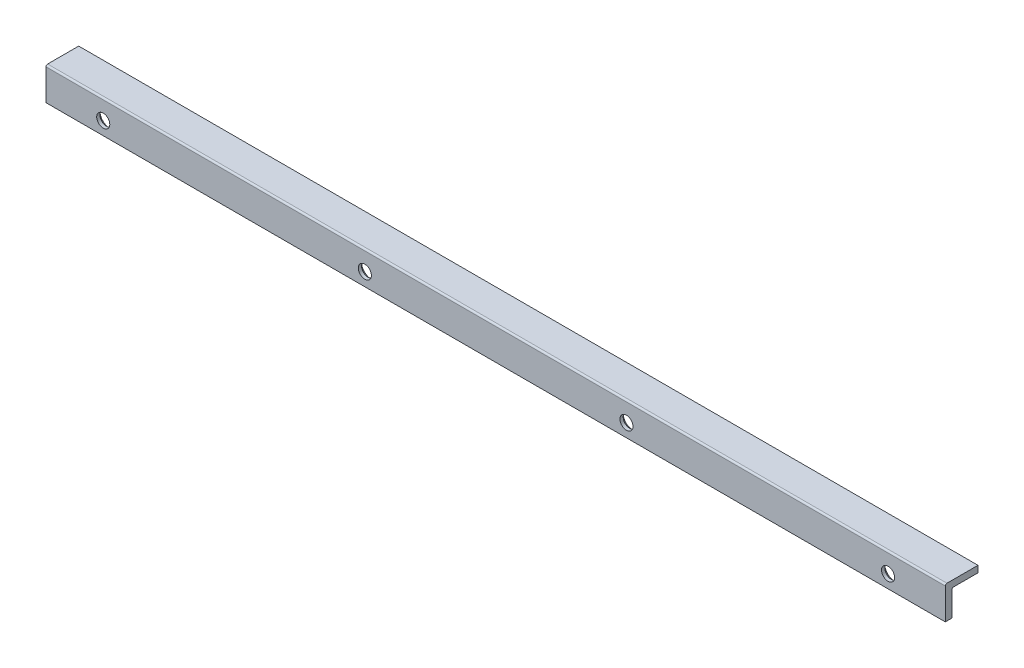
ISO-10303-21;
HEADER;
FILE_DESCRIPTION(('STEP AP214'),'2;1');
FILE_NAME('part.step','',(''),(''),'','','');
FILE_SCHEMA(('AUTOMOTIVE_DESIGN { 1 0 10303 214 1 1 1 1 }'));
ENDSEC;
DATA;
#1=APPLICATION_CONTEXT('core data for automotive mechanical design processes');
#2=APPLICATION_PROTOCOL_DEFINITION('international standard','automotive_design',2000,#1);
#3=PRODUCT_CONTEXT('',#1,'mechanical');
#4=PRODUCT('Part','Part','',(#3));
#5=PRODUCT_RELATED_PRODUCT_CATEGORY('part','',(#4));
#6=PRODUCT_DEFINITION_FORMATION('','',#4);
#7=PRODUCT_DEFINITION_CONTEXT('part definition',#1,'design');
#8=PRODUCT_DEFINITION('design','',#6,#7);
#9=PRODUCT_DEFINITION_SHAPE('','',#8);
#10=(LENGTH_UNIT() NAMED_UNIT(*) SI_UNIT(.MILLI.,.METRE.));
#11=(NAMED_UNIT(*) PLANE_ANGLE_UNIT() SI_UNIT($,.RADIAN.));
#12=(NAMED_UNIT(*) SI_UNIT($,.STERADIAN.) SOLID_ANGLE_UNIT());
#13=UNCERTAINTY_MEASURE_WITH_UNIT(LENGTH_MEASURE(1.E-05),#10,'distance_accuracy_value','');
#14=(GEOMETRIC_REPRESENTATION_CONTEXT(3) GLOBAL_UNCERTAINTY_ASSIGNED_CONTEXT((#13)) GLOBAL_UNIT_ASSIGNED_CONTEXT((#10,
#11,#12)) REPRESENTATION_CONTEXT('',''));
#15=CARTESIAN_POINT('',(0.,0.,0.));
#16=DIRECTION('',(0.,0.,1.));
#17=DIRECTION('',(1.,0.,0.));
#18=AXIS2_PLACEMENT_3D('',#15,#16,#17);
#19=CARTESIAN_POINT('',(-137.5,-10.,0.));
#20=DIRECTION('',(0.,-1.,0.));
#21=DIRECTION('',(0.,0.,-1.));
#22=AXIS2_PLACEMENT_3D('',#19,#20,#21);
#23=PLANE('',#22);
#24=DIRECTION('',(1.,0.,0.));
#25=VECTOR('',#24,1.);
#26=CARTESIAN_POINT('',(-137.5,-10.,-2.));
#27=LINE('',#26,#25);
#28=CARTESIAN_POINT('',(-137.5,-10.,-2.));
#29=VERTEX_POINT('',#28);
#30=CARTESIAN_POINT('',(137.5,-10.,-2.));
#31=VERTEX_POINT('',#30);
#32=EDGE_CURVE('E114',#29,#31,#27,.T.);
#33=ORIENTED_EDGE('',*,*,#32,.T.);
#34=DIRECTION('',(0.,0.,-1.));
#35=VECTOR('',#34,1.);
#36=CARTESIAN_POINT('',(137.5,-10.,0.));
#37=LINE('',#36,#35);
#38=CARTESIAN_POINT('',(137.5,-10.,0.));
#39=VERTEX_POINT('',#38);
#40=EDGE_CURVE('E117',#39,#31,#37,.T.);
#41=ORIENTED_EDGE('',*,*,#40,.F.);
#42=DIRECTION('',(1.,0.,0.));
#43=VECTOR('',#42,1.);
#44=CARTESIAN_POINT('',(-137.5,-10.,0.));
#45=LINE('',#44,#43);
#46=CARTESIAN_POINT('',(-137.5,-10.,0.));
#47=VERTEX_POINT('',#46);
#48=EDGE_CURVE('E65',#47,#39,#45,.T.);
#49=ORIENTED_EDGE('',*,*,#48,.F.);
#50=DIRECTION('',(0.,0.,-1.));
#51=VECTOR('',#50,1.);
#52=CARTESIAN_POINT('',(-137.5,-10.,0.));
#53=LINE('',#52,#51);
#54=EDGE_CURVE('E118',#47,#29,#53,.T.);
#55=ORIENTED_EDGE('',*,*,#54,.T.);
#56=EDGE_LOOP('',(#33,#41,#49,#55));
#57=FACE_BOUND('',#56,.T.);
#58=ADVANCED_FACE('F48',(#57),#23,.T.);
#59=CARTESIAN_POINT('',(-137.5,-10.,0.));
#60=DIRECTION('',(0.,0.,1.));
#61=DIRECTION('',(1.,0.,0.));
#62=AXIS2_PLACEMENT_3D('',#59,#60,#61);
#63=PLANE('',#62);
#64=CARTESIAN_POINT('',(-120.,-6.00000000000001,0.));
#65=DIRECTION('',(0.,0.,1.));
#66=DIRECTION('',(1.,0.,0.));
#67=AXIS2_PLACEMENT_3D('',#64,#65,#66);
#68=CIRCLE('',#67,2.);
#69=CARTESIAN_POINT('',(-118.,-6.00000000000001,0.));
#70=VERTEX_POINT('',#69);
#71=EDGE_CURVE('E140',#70,#70,#68,.T.);
#72=ORIENTED_EDGE('',*,*,#71,.F.);
#73=EDGE_LOOP('',(#72));
#74=FACE_BOUND('',#73,.T.);
#75=CARTESIAN_POINT('',(-40.,-6.,0.));
#76=DIRECTION('',(0.,0.,1.));
#77=DIRECTION('',(1.,0.,0.));
#78=AXIS2_PLACEMENT_3D('',#75,#76,#77);
#79=CIRCLE('',#78,2.);
#80=CARTESIAN_POINT('',(-38.,-6.,0.));
#81=VERTEX_POINT('',#80);
#82=EDGE_CURVE('E144',#81,#81,#79,.T.);
#83=ORIENTED_EDGE('',*,*,#82,.F.);
#84=EDGE_LOOP('',(#83));
#85=FACE_BOUND('',#84,.T.);
#86=CARTESIAN_POINT('',(40.,-5.99999999999999,0.));
#87=DIRECTION('',(0.,0.,1.));
#88=DIRECTION('',(1.,0.,0.));
#89=AXIS2_PLACEMENT_3D('',#86,#87,#88);
#90=CIRCLE('',#89,2.);
#91=CARTESIAN_POINT('',(42.,-5.99999999999999,0.));
#92=VERTEX_POINT('',#91);
#93=EDGE_CURVE('E301',#92,#92,#90,.T.);
#94=ORIENTED_EDGE('',*,*,#93,.F.);
#95=EDGE_LOOP('',(#94));
#96=FACE_BOUND('',#95,.T.);
#97=CARTESIAN_POINT('',(120.,-5.99999999999997,0.));
#98=DIRECTION('',(0.,0.,1.));
#99=DIRECTION('',(1.,0.,0.));
#100=AXIS2_PLACEMENT_3D('',#97,#98,#99);
#101=CIRCLE('',#100,2.);
#102=CARTESIAN_POINT('',(122.,-5.99999999999997,0.));
#103=VERTEX_POINT('',#102);
#104=EDGE_CURVE('E147',#103,#103,#101,.T.);
#105=ORIENTED_EDGE('',*,*,#104,.F.);
#106=EDGE_LOOP('',(#105));
#107=FACE_BOUND('',#106,.T.);
#108=ORIENTED_EDGE('',*,*,#48,.T.);
#109=DIRECTION('',(0.,-1.,0.));
#110=VECTOR('',#109,1.);
#111=CARTESIAN_POINT('',(137.5,-10.,0.));
#112=LINE('',#111,#110);
#113=CARTESIAN_POINT('',(137.5,-0.500000000000004,0.));
#114=VERTEX_POINT('',#113);
#115=EDGE_CURVE('E138',#114,#39,#112,.T.);
#116=ORIENTED_EDGE('',*,*,#115,.F.);
#117=DIRECTION('',(1.,0.,0.));
#118=VECTOR('',#117,1.);
#119=CARTESIAN_POINT('',(-137.5,-0.500000000000004,0.));
#120=LINE('',#119,#118);
#121=CARTESIAN_POINT('',(-137.5,-0.500000000000004,0.));
#122=VERTEX_POINT('',#121);
#123=EDGE_CURVE('E73',#122,#114,#120,.T.);
#124=ORIENTED_EDGE('',*,*,#123,.F.);
#125=DIRECTION('',(0.,-1.,0.));
#126=VECTOR('',#125,1.);
#127=CARTESIAN_POINT('',(-137.5,-10.,0.));
#128=LINE('',#127,#126);
#129=EDGE_CURVE('E124',#122,#47,#128,.T.);
#130=ORIENTED_EDGE('',*,*,#129,.T.);
#131=EDGE_LOOP('',(#108,#116,#124,#130));
#132=FACE_BOUND('',#131,.T.);
#133=ADVANCED_FACE('F258',(#74,#85,#96,#107,#132),#63,.T.);
#134=CARTESIAN_POINT('',(-137.5,-0.5,-0.5));
#135=DIRECTION('',(1.,0.,0.));
#136=DIRECTION('',(0.,0.,-1.));
#137=AXIS2_PLACEMENT_3D('',#134,#135,#136);
#138=CYLINDRICAL_SURFACE('',#137,0.5);
#139=ORIENTED_EDGE('',*,*,#123,.T.);
#140=CARTESIAN_POINT('',(137.5,-0.5,-0.5));
#141=DIRECTION('',(1.,0.,0.));
#142=DIRECTION('',(0.,0.,1.));
#143=AXIS2_PLACEMENT_3D('',#140,#141,#142);
#144=CIRCLE('',#143,0.5);
#145=CARTESIAN_POINT('',(137.5,0.,-0.500000000000003));
#146=VERTEX_POINT('',#145);
#147=EDGE_CURVE('E164',#146,#114,#144,.T.);
#148=ORIENTED_EDGE('',*,*,#147,.F.);
#149=DIRECTION('',(1.,0.,0.));
#150=VECTOR('',#149,1.);
#151=CARTESIAN_POINT('',(-137.5,0.,-0.500000000000003));
#152=LINE('',#151,#150);
#153=CARTESIAN_POINT('',(-137.5,0.,-0.500000000000003));
#154=VERTEX_POINT('',#153);
#155=EDGE_CURVE('E200',#154,#146,#152,.T.);
#156=ORIENTED_EDGE('',*,*,#155,.F.);
#157=CARTESIAN_POINT('',(-137.5,-0.5,-0.5));
#158=DIRECTION('',(1.,0.,0.));
#159=DIRECTION('',(0.,0.,1.));
#160=AXIS2_PLACEMENT_3D('',#157,#158,#159);
#161=CIRCLE('',#160,0.5);
#162=EDGE_CURVE('E190',#154,#122,#161,.T.);
#163=ORIENTED_EDGE('',*,*,#162,.T.);
#164=EDGE_LOOP('',(#139,#148,#156,#163));
#165=FACE_BOUND('',#164,.T.);
#166=ADVANCED_FACE('F264',(#165),#138,.T.);
#167=CARTESIAN_POINT('',(-137.5,0.,-0.500000000000004));
#168=DIRECTION('',(0.,1.,0.));
#169=DIRECTION('',(0.,0.,1.));
#170=AXIS2_PLACEMENT_3D('',#167,#168,#169);
#171=PLANE('',#170);
#172=ORIENTED_EDGE('',*,*,#155,.T.);
#173=DIRECTION('',(0.,0.,1.));
#174=VECTOR('',#173,1.);
#175=CARTESIAN_POINT('',(137.5,0.,-0.500000000000004));
#176=LINE('',#175,#174);
#177=CARTESIAN_POINT('',(137.5,0.,-10.));
#178=VERTEX_POINT('',#177);
#179=EDGE_CURVE('E160',#178,#146,#176,.T.);
#180=ORIENTED_EDGE('',*,*,#179,.F.);
#181=DIRECTION('',(1.,0.,0.));
#182=VECTOR('',#181,1.);
#183=CARTESIAN_POINT('',(-137.5,0.,-10.));
#184=LINE('',#183,#182);
#185=CARTESIAN_POINT('',(-137.5,0.,-10.));
#186=VERTEX_POINT('',#185);
#187=EDGE_CURVE('E203',#186,#178,#184,.T.);
#188=ORIENTED_EDGE('',*,*,#187,.F.);
#189=DIRECTION('',(0.,0.,1.));
#190=VECTOR('',#189,1.);
#191=CARTESIAN_POINT('',(-137.5,0.,-0.500000000000004));
#192=LINE('',#191,#190);
#193=EDGE_CURVE('E186',#186,#154,#192,.T.);
#194=ORIENTED_EDGE('',*,*,#193,.T.);
#195=EDGE_LOOP('',(#172,#180,#188,#194));
#196=FACE_BOUND('',#195,.T.);
#197=ADVANCED_FACE('F321',(#196),#171,.T.);
#198=CARTESIAN_POINT('',(-137.5,0.,-10.));
#199=DIRECTION('',(0.,0.,-1.));
#200=DIRECTION('',(-1.,0.,0.));
#201=AXIS2_PLACEMENT_3D('',#198,#199,#200);
#202=PLANE('',#201);
#203=ORIENTED_EDGE('',*,*,#187,.T.);
#204=DIRECTION('',(0.,1.,0.));
#205=VECTOR('',#204,1.);
#206=CARTESIAN_POINT('',(137.5,0.,-10.));
#207=LINE('',#206,#205);
#208=CARTESIAN_POINT('',(137.5,-2.,-10.));
#209=VERTEX_POINT('',#208);
#210=EDGE_CURVE('E156',#209,#178,#207,.T.);
#211=ORIENTED_EDGE('',*,*,#210,.F.);
#212=DIRECTION('',(1.,0.,0.));
#213=VECTOR('',#212,1.);
#214=CARTESIAN_POINT('',(-137.5,-2.,-10.));
#215=LINE('',#214,#213);
#216=CARTESIAN_POINT('',(-137.5,-2.,-10.));
#217=VERTEX_POINT('',#216);
#218=EDGE_CURVE('E206',#217,#209,#215,.T.);
#219=ORIENTED_EDGE('',*,*,#218,.F.);
#220=DIRECTION('',(0.,1.,0.));
#221=VECTOR('',#220,1.);
#222=CARTESIAN_POINT('',(-137.5,0.,-10.));
#223=LINE('',#222,#221);
#224=EDGE_CURVE('E182',#217,#186,#223,.T.);
#225=ORIENTED_EDGE('',*,*,#224,.T.);
#226=EDGE_LOOP('',(#203,#211,#219,#225));
#227=FACE_BOUND('',#226,.T.);
#228=ADVANCED_FACE('F319',(#227),#202,.T.);
#229=CARTESIAN_POINT('',(-137.5,-2.,-10.));
#230=DIRECTION('',(0.,-1.,0.));
#231=DIRECTION('',(0.,0.,-1.));
#232=AXIS2_PLACEMENT_3D('',#229,#230,#231);
#233=PLANE('',#232);
#234=ORIENTED_EDGE('',*,*,#218,.T.);
#235=DIRECTION('',(0.,0.,-1.));
#236=VECTOR('',#235,1.);
#237=CARTESIAN_POINT('',(137.5,-2.,-10.));
#238=LINE('',#237,#236);
#239=CARTESIAN_POINT('',(137.5,-2.,-2.5));
#240=VERTEX_POINT('',#239);
#241=EDGE_CURVE('E152',#240,#209,#238,.T.);
#242=ORIENTED_EDGE('',*,*,#241,.F.);
#243=DIRECTION('',(1.,0.,0.));
#244=VECTOR('',#243,1.);
#245=CARTESIAN_POINT('',(-137.5,-2.,-2.5));
#246=LINE('',#245,#244);
#247=CARTESIAN_POINT('',(-137.5,-2.,-2.5));
#248=VERTEX_POINT('',#247);
#249=EDGE_CURVE('E209',#248,#240,#246,.T.);
#250=ORIENTED_EDGE('',*,*,#249,.F.);
#251=DIRECTION('',(0.,0.,-1.));
#252=VECTOR('',#251,1.);
#253=CARTESIAN_POINT('',(-137.5,-2.,-10.));
#254=LINE('',#253,#252);
#255=EDGE_CURVE('E178',#248,#217,#254,.T.);
#256=ORIENTED_EDGE('',*,*,#255,.T.);
#257=EDGE_LOOP('',(#234,#242,#250,#256));
#258=FACE_BOUND('',#257,.T.);
#259=ADVANCED_FACE('F317',(#258),#233,.T.);
#260=CARTESIAN_POINT('',(-137.5,-2.5,-2.5));
#261=DIRECTION('',(1.,0.,0.));
#262=DIRECTION('',(0.,0.,-1.));
#263=AXIS2_PLACEMENT_3D('',#260,#261,#262);
#264=CYLINDRICAL_SURFACE('',#263,0.5);
#265=ORIENTED_EDGE('',*,*,#249,.T.);
#266=CARTESIAN_POINT('',(137.5,-2.5,-2.5));
#267=DIRECTION('',(-1.,0.,0.));
#268=DIRECTION('',(0.,0.,-1.));
#269=AXIS2_PLACEMENT_3D('',#266,#267,#268);
#270=CIRCLE('',#269,0.5);
#271=CARTESIAN_POINT('',(137.5,-2.5,-2.));
#272=VERTEX_POINT('',#271);
#273=EDGE_CURVE('E133',#272,#240,#270,.T.);
#274=ORIENTED_EDGE('',*,*,#273,.F.);
#275=DIRECTION('',(1.,0.,0.));
#276=VECTOR('',#275,1.);
#277=CARTESIAN_POINT('',(-137.5,-2.5,-2.));
#278=LINE('',#277,#276);
#279=CARTESIAN_POINT('',(-137.5,-2.5,-2.));
#280=VERTEX_POINT('',#279);
#281=EDGE_CURVE('E123',#280,#272,#278,.T.);
#282=ORIENTED_EDGE('',*,*,#281,.F.);
#283=CARTESIAN_POINT('',(-137.5,-2.5,-2.5));
#284=DIRECTION('',(-1.,0.,0.));
#285=DIRECTION('',(0.,0.,-1.));
#286=AXIS2_PLACEMENT_3D('',#283,#284,#285);
#287=CIRCLE('',#286,0.5);
#288=EDGE_CURVE('E174',#280,#248,#287,.T.);
#289=ORIENTED_EDGE('',*,*,#288,.T.);
#290=EDGE_LOOP('',(#265,#274,#282,#289));
#291=FACE_BOUND('',#290,.T.);
#292=ADVANCED_FACE('F313',(#291),#264,.F.);
#293=CARTESIAN_POINT('',(-137.5,-10.,-2.));
#294=DIRECTION('',(0.,0.,-1.));
#295=DIRECTION('',(-1.,0.,0.));
#296=AXIS2_PLACEMENT_3D('',#293,#294,#295);
#297=PLANE('',#296);
#298=CARTESIAN_POINT('',(-120.,-6.00000000000001,-2.));
#299=DIRECTION('',(0.,0.,-1.));
#300=DIRECTION('',(-1.,0.,0.));
#301=AXIS2_PLACEMENT_3D('',#298,#299,#300);
#302=CIRCLE('',#301,3.);
#303=CARTESIAN_POINT('',(-123.,-6.00000000000001,-2.));
#304=VERTEX_POINT('',#303);
#305=EDGE_CURVE('E229',#304,#304,#302,.F.);
#306=ORIENTED_EDGE('',*,*,#305,.T.);
#307=EDGE_LOOP('',(#306));
#308=FACE_BOUND('',#307,.T.);
#309=CARTESIAN_POINT('',(-40.,-6.,-2.));
#310=DIRECTION('',(0.,0.,-1.));
#311=DIRECTION('',(-1.,0.,0.));
#312=AXIS2_PLACEMENT_3D('',#309,#310,#311);
#313=CIRCLE('',#312,3.);
#314=CARTESIAN_POINT('',(-43.,-6.,-2.));
#315=VERTEX_POINT('',#314);
#316=EDGE_CURVE('E225',#315,#315,#313,.F.);
#317=ORIENTED_EDGE('',*,*,#316,.T.);
#318=EDGE_LOOP('',(#317));
#319=FACE_BOUND('',#318,.T.);
#320=CARTESIAN_POINT('',(40.,-5.99999999999999,-2.));
#321=DIRECTION('',(0.,0.,-1.));
#322=DIRECTION('',(-1.,0.,0.));
#323=AXIS2_PLACEMENT_3D('',#320,#321,#322);
#324=CIRCLE('',#323,3.);
#325=CARTESIAN_POINT('',(37.,-5.99999999999999,-2.));
#326=VERTEX_POINT('',#325);
#327=EDGE_CURVE('E221',#326,#326,#324,.F.);
#328=ORIENTED_EDGE('',*,*,#327,.T.);
#329=EDGE_LOOP('',(#328));
#330=FACE_BOUND('',#329,.T.);
#331=CARTESIAN_POINT('',(120.,-5.99999999999997,-2.));
#332=DIRECTION('',(0.,0.,-1.));
#333=DIRECTION('',(-1.,0.,0.));
#334=AXIS2_PLACEMENT_3D('',#331,#332,#333);
#335=CIRCLE('',#334,3.);
#336=CARTESIAN_POINT('',(117.,-5.99999999999997,-2.));
#337=VERTEX_POINT('',#336);
#338=EDGE_CURVE('E217',#337,#337,#335,.F.);
#339=ORIENTED_EDGE('',*,*,#338,.T.);
#340=EDGE_LOOP('',(#339));
#341=FACE_BOUND('',#340,.T.);
#342=ORIENTED_EDGE('',*,*,#281,.T.);
#343=DIRECTION('',(0.,1.,0.));
#344=VECTOR('',#343,1.);
#345=CARTESIAN_POINT('',(137.5,-10.,-2.));
#346=LINE('',#345,#344);
#347=EDGE_CURVE('E127',#31,#272,#346,.T.);
#348=ORIENTED_EDGE('',*,*,#347,.F.);
#349=ORIENTED_EDGE('',*,*,#32,.F.);
#350=DIRECTION('',(0.,1.,0.));
#351=VECTOR('',#350,1.);
#352=CARTESIAN_POINT('',(-137.5,-10.,-2.));
#353=LINE('',#352,#351);
#354=EDGE_CURVE('E171',#29,#280,#353,.T.);
#355=ORIENTED_EDGE('',*,*,#354,.T.);
#356=EDGE_LOOP('',(#342,#348,#349,#355));
#357=FACE_BOUND('',#356,.T.);
#358=ADVANCED_FACE('F128',(#308,#319,#330,#341,#357),#297,.T.);
#359=CARTESIAN_POINT('',(-137.5,-2.5,-2.5));
#360=DIRECTION('',(1.,0.,0.));
#361=DIRECTION('',(0.,0.,-1.));
#362=AXIS2_PLACEMENT_3D('',#359,#360,#361);
#363=PLANE('',#362);
#364=ORIENTED_EDGE('',*,*,#54,.F.);
#365=ORIENTED_EDGE('',*,*,#129,.F.);
#366=ORIENTED_EDGE('',*,*,#162,.F.);
#367=ORIENTED_EDGE('',*,*,#193,.F.);
#368=ORIENTED_EDGE('',*,*,#224,.F.);
#369=ORIENTED_EDGE('',*,*,#255,.F.);
#370=ORIENTED_EDGE('',*,*,#288,.F.);
#371=ORIENTED_EDGE('',*,*,#354,.F.);
#372=EDGE_LOOP('',(#364,#365,#366,#367,#368,#369,#370,#371));
#373=FACE_BOUND('',#372,.T.);
#374=ADVANCED_FACE('F307',(#373),#363,.F.);
#375=CARTESIAN_POINT('',(137.5,-2.5,-2.5));
#376=DIRECTION('',(1.,0.,0.));
#377=DIRECTION('',(0.,0.,-1.));
#378=AXIS2_PLACEMENT_3D('',#375,#376,#377);
#379=PLANE('',#378);
#380=ORIENTED_EDGE('',*,*,#40,.T.);
#381=ORIENTED_EDGE('',*,*,#347,.T.);
#382=ORIENTED_EDGE('',*,*,#273,.T.);
#383=ORIENTED_EDGE('',*,*,#241,.T.);
#384=ORIENTED_EDGE('',*,*,#210,.T.);
#385=ORIENTED_EDGE('',*,*,#179,.T.);
#386=ORIENTED_EDGE('',*,*,#147,.T.);
#387=ORIENTED_EDGE('',*,*,#115,.T.);
#388=EDGE_LOOP('',(#380,#381,#382,#383,#384,#385,#386,#387));
#389=FACE_BOUND('',#388,.T.);
#390=ADVANCED_FACE('F136',(#389),#379,.T.);
#391=CARTESIAN_POINT('',(120.,-5.99999999999997,-10.));
#392=DIRECTION('',(0.,0.,1.));
#393=DIRECTION('',(1.,0.,0.));
#394=AXIS2_PLACEMENT_3D('',#391,#392,#393);
#395=CYLINDRICAL_SURFACE('',#394,2.);
#396=CARTESIAN_POINT('',(120.,-5.99999999999997,-1.00000000000001));
#397=DIRECTION('',(0.,0.,-1.));
#398=DIRECTION('',(-1.,0.,0.));
#399=AXIS2_PLACEMENT_3D('',#396,#397,#398);
#400=CIRCLE('',#399,2.);
#401=CARTESIAN_POINT('',(118.,-5.99999999999997,-1.00000000000001));
#402=VERTEX_POINT('',#401);
#403=EDGE_CURVE('E11',#402,#402,#400,.T.);
#404=ORIENTED_EDGE('',*,*,#403,.T.);
#405=EDGE_LOOP('',(#404));
#406=FACE_BOUND('',#405,.T.);
#407=ORIENTED_EDGE('',*,*,#104,.T.);
#408=EDGE_LOOP('',(#407));
#409=FACE_BOUND('',#408,.T.);
#410=ADVANCED_FACE('F352',(#406,#409),#395,.F.);
#411=CARTESIAN_POINT('',(40.,-5.99999999999999,-10.));
#412=DIRECTION('',(0.,0.,1.));
#413=DIRECTION('',(1.,0.,0.));
#414=AXIS2_PLACEMENT_3D('',#411,#412,#413);
#415=CYLINDRICAL_SURFACE('',#414,2.);
#416=CARTESIAN_POINT('',(40.,-5.99999999999999,-1.00000000000002));
#417=DIRECTION('',(0.,0.,-1.));
#418=DIRECTION('',(-1.,0.,0.));
#419=AXIS2_PLACEMENT_3D('',#416,#417,#418);
#420=CIRCLE('',#419,2.);
#421=CARTESIAN_POINT('',(38.,-5.99999999999999,-1.00000000000002));
#422=VERTEX_POINT('',#421);
#423=EDGE_CURVE('E58',#422,#422,#420,.T.);
#424=ORIENTED_EDGE('',*,*,#423,.T.);
#425=EDGE_LOOP('',(#424));
#426=FACE_BOUND('',#425,.T.);
#427=ORIENTED_EDGE('',*,*,#93,.T.);
#428=EDGE_LOOP('',(#427));
#429=FACE_BOUND('',#428,.T.);
#430=ADVANCED_FACE('F240',(#426,#429),#415,.F.);
#431=CARTESIAN_POINT('',(-40.,-6.,-10.));
#432=DIRECTION('',(0.,0.,1.));
#433=DIRECTION('',(1.,0.,0.));
#434=AXIS2_PLACEMENT_3D('',#431,#432,#433);
#435=CYLINDRICAL_SURFACE('',#434,2.);
#436=CARTESIAN_POINT('',(-40.,-6.,-1.00000000000002));
#437=DIRECTION('',(0.,0.,-1.));
#438=DIRECTION('',(-1.,0.,0.));
#439=AXIS2_PLACEMENT_3D('',#436,#437,#438);
#440=CIRCLE('',#439,2.);
#441=CARTESIAN_POINT('',(-42.,-6.,-1.00000000000002));
#442=VERTEX_POINT('',#441);
#443=EDGE_CURVE('E233',#442,#442,#440,.T.);
#444=ORIENTED_EDGE('',*,*,#443,.T.);
#445=EDGE_LOOP('',(#444));
#446=FACE_BOUND('',#445,.T.);
#447=ORIENTED_EDGE('',*,*,#82,.T.);
#448=EDGE_LOOP('',(#447));
#449=FACE_BOUND('',#448,.T.);
#450=ADVANCED_FACE('F286',(#446,#449),#435,.F.);
#451=CARTESIAN_POINT('',(-120.,-6.00000000000001,-10.));
#452=DIRECTION('',(0.,0.,1.));
#453=DIRECTION('',(1.,0.,0.));
#454=AXIS2_PLACEMENT_3D('',#451,#452,#453);
#455=CYLINDRICAL_SURFACE('',#454,2.);
#456=CARTESIAN_POINT('',(-120.,-6.00000000000001,-1.00000000000001));
#457=DIRECTION('',(0.,0.,-1.));
#458=DIRECTION('',(-1.,0.,0.));
#459=AXIS2_PLACEMENT_3D('',#456,#457,#458);
#460=CIRCLE('',#459,2.);
#461=CARTESIAN_POINT('',(-122.,-6.00000000000001,-1.00000000000001));
#462=VERTEX_POINT('',#461);
#463=EDGE_CURVE('E197',#462,#462,#460,.T.);
#464=ORIENTED_EDGE('',*,*,#463,.T.);
#465=EDGE_LOOP('',(#464));
#466=FACE_BOUND('',#465,.T.);
#467=ORIENTED_EDGE('',*,*,#71,.T.);
#468=EDGE_LOOP('',(#467));
#469=FACE_BOUND('',#468,.T.);
#470=ADVANCED_FACE('F275',(#466,#469),#455,.F.);
#471=CARTESIAN_POINT('',(-120.,-6.00000000000001,-1.00000000000001));
#472=DIRECTION('',(0.,0.,-1.));
#473=DIRECTION('',(-1.,0.,0.));
#474=AXIS2_PLACEMENT_3D('',#471,#472,#473);
#475=CONICAL_SURFACE('',#474,2.,0.785398163397459);
#476=ORIENTED_EDGE('',*,*,#305,.F.);
#477=EDGE_LOOP('',(#476));
#478=FACE_BOUND('',#477,.T.);
#479=ORIENTED_EDGE('',*,*,#463,.F.);
#480=EDGE_LOOP('',(#479));
#481=FACE_BOUND('',#480,.T.);
#482=ADVANCED_FACE('F252',(#478,#481),#475,.F.);
#483=CARTESIAN_POINT('',(-40.,-6.,-1.00000000000002));
#484=DIRECTION('',(0.,0.,-1.));
#485=DIRECTION('',(-1.,0.,0.));
#486=AXIS2_PLACEMENT_3D('',#483,#484,#485);
#487=CONICAL_SURFACE('',#486,2.,0.785398163397459);
#488=ORIENTED_EDGE('',*,*,#316,.F.);
#489=EDGE_LOOP('',(#488));
#490=FACE_BOUND('',#489,.T.);
#491=ORIENTED_EDGE('',*,*,#443,.F.);
#492=EDGE_LOOP('',(#491));
#493=FACE_BOUND('',#492,.T.);
#494=ADVANCED_FACE('F245',(#490,#493),#487,.F.);
#495=CARTESIAN_POINT('',(40.,-5.99999999999999,-1.00000000000002));
#496=DIRECTION('',(0.,0.,-1.));
#497=DIRECTION('',(-1.,0.,0.));
#498=AXIS2_PLACEMENT_3D('',#495,#496,#497);
#499=CONICAL_SURFACE('',#498,2.,0.785398163397459);
#500=ORIENTED_EDGE('',*,*,#327,.F.);
#501=EDGE_LOOP('',(#500));
#502=FACE_BOUND('',#501,.T.);
#503=ORIENTED_EDGE('',*,*,#423,.F.);
#504=EDGE_LOOP('',(#503));
#505=FACE_BOUND('',#504,.T.);
#506=ADVANCED_FACE('F243',(#502,#505),#499,.F.);
#507=CARTESIAN_POINT('',(120.,-5.99999999999997,-1.00000000000001));
#508=DIRECTION('',(0.,0.,-1.));
#509=DIRECTION('',(-1.,0.,0.));
#510=AXIS2_PLACEMENT_3D('',#507,#508,#509);
#511=CONICAL_SURFACE('',#510,2.,0.785398163397459);
#512=ORIENTED_EDGE('',*,*,#338,.F.);
#513=EDGE_LOOP('',(#512));
#514=FACE_BOUND('',#513,.T.);
#515=ORIENTED_EDGE('',*,*,#403,.F.);
#516=EDGE_LOOP('',(#515));
#517=FACE_BOUND('',#516,.T.);
#518=ADVANCED_FACE('F51',(#514,#517),#511,.F.);
#519=CLOSED_SHELL('',(#58,#133,#166,#197,#228,#259,#292,#358,#374,#390,#410,#430,#450,#470,#482,
#494,#506,#518));
#520=MANIFOLD_SOLID_BREP('B2',#519);
#521=ADVANCED_BREP_SHAPE_REPRESENTATION('',(#18,#520),#14);
#522=SHAPE_DEFINITION_REPRESENTATION(#9,#521);
ENDSEC;
END-ISO-10303-21;
